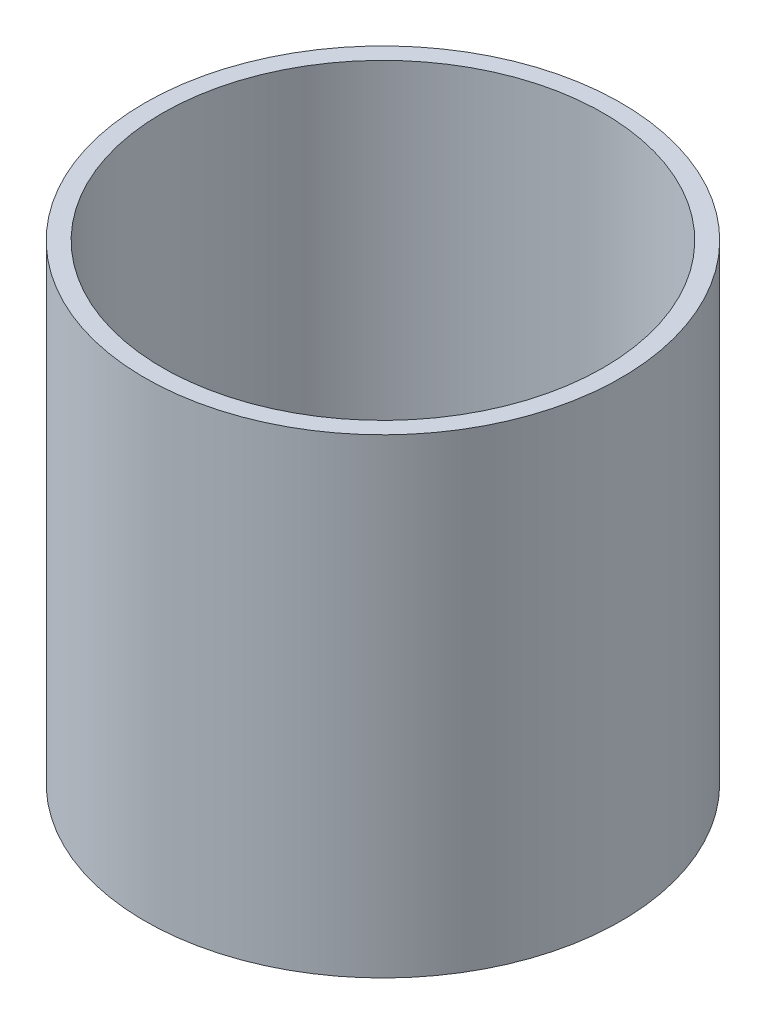
ISO-10303-21;
HEADER;
FILE_DESCRIPTION(('STEP AP214'),'2;1');
FILE_NAME('part.step','',(''),(''),'','','');
FILE_SCHEMA(('AUTOMOTIVE_DESIGN { 1 0 10303 214 1 1 1 1 }'));
ENDSEC;
DATA;
#1=APPLICATION_CONTEXT('core data for automotive mechanical design processes');
#2=APPLICATION_PROTOCOL_DEFINITION('international standard','automotive_design',2000,#1);
#3=PRODUCT_CONTEXT('',#1,'mechanical');
#4=PRODUCT('Part','Part','',(#3));
#5=PRODUCT_RELATED_PRODUCT_CATEGORY('part','',(#4));
#6=PRODUCT_DEFINITION_FORMATION('','',#4);
#7=PRODUCT_DEFINITION_CONTEXT('part definition',#1,'design');
#8=PRODUCT_DEFINITION('design','',#6,#7);
#9=PRODUCT_DEFINITION_SHAPE('','',#8);
#10=(LENGTH_UNIT() NAMED_UNIT(*) SI_UNIT(.MILLI.,.METRE.));
#11=(NAMED_UNIT(*) PLANE_ANGLE_UNIT() SI_UNIT($,.RADIAN.));
#12=(NAMED_UNIT(*) SI_UNIT($,.STERADIAN.) SOLID_ANGLE_UNIT());
#13=UNCERTAINTY_MEASURE_WITH_UNIT(LENGTH_MEASURE(1.E-05),#10,'distance_accuracy_value','');
#14=(GEOMETRIC_REPRESENTATION_CONTEXT(3) GLOBAL_UNCERTAINTY_ASSIGNED_CONTEXT((#13)) GLOBAL_UNIT_ASSIGNED_CONTEXT((#10,
#11,#12)) REPRESENTATION_CONTEXT('',''));
#15=CARTESIAN_POINT('',(0.,0.,0.));
#16=DIRECTION('',(0.,0.,1.));
#17=DIRECTION('',(1.,0.,0.));
#18=AXIS2_PLACEMENT_3D('',#15,#16,#17);
#19=CARTESIAN_POINT('',(-27.5,5.5,0.));
#20=DIRECTION('',(0.,1.,0.));
#21=DIRECTION('',(-1.,0.,0.));
#22=AXIS2_PLACEMENT_3D('',#19,#20,#21);
#23=PLANE('',#22);
#24=CARTESIAN_POINT('',(12.7,5.5,0.));
#25=DIRECTION('',(0.,1.,0.));
#26=DIRECTION('',(-1.,0.,0.));
#27=AXIS2_PLACEMENT_3D('',#24,#25,#26);
#28=CIRCLE('',#27,1.88162581394964);
#29=CARTESIAN_POINT('',(10.8183741860504,5.5,0.));
#30=VERTEX_POINT('',#29);
#31=EDGE_CURVE('E81',#30,#30,#28,.F.);
#32=ORIENTED_EDGE('',*,*,#31,.T.);
#33=EDGE_LOOP('',(#32));
#34=FACE_BOUND('',#33,.T.);
#35=CARTESIAN_POINT('',(0.,5.5,-12.7));
#36=DIRECTION('',(0.,1.,0.));
#37=DIRECTION('',(-1.,0.,0.));
#38=AXIS2_PLACEMENT_3D('',#35,#36,#37);
#39=CIRCLE('',#38,1.88162581394964);
#40=CARTESIAN_POINT('',(-1.88162581394964,5.5,-12.7));
#41=VERTEX_POINT('',#40);
#42=EDGE_CURVE('E75',#41,#41,#39,.F.);
#43=ORIENTED_EDGE('',*,*,#42,.T.);
#44=EDGE_LOOP('',(#43));
#45=FACE_BOUND('',#44,.T.);
#46=CARTESIAN_POINT('',(-12.7,5.5,1.33025439009923E-13));
#47=DIRECTION('',(0.,1.,0.));
#48=DIRECTION('',(-1.,0.,0.));
#49=AXIS2_PLACEMENT_3D('',#46,#47,#48);
#50=CIRCLE('',#49,1.88162581394964);
#51=CARTESIAN_POINT('',(-14.5816258139496,5.5,1.33025439009923E-13));
#52=VERTEX_POINT('',#51);
#53=EDGE_CURVE('E69',#52,#52,#50,.F.);
#54=ORIENTED_EDGE('',*,*,#53,.T.);
#55=EDGE_LOOP('',(#54));
#56=FACE_BOUND('',#55,.T.);
#57=CARTESIAN_POINT('',(0.,5.5,12.7));
#58=DIRECTION('',(0.,1.,0.));
#59=DIRECTION('',(-1.,0.,0.));
#60=AXIS2_PLACEMENT_3D('',#57,#58,#59);
#61=CIRCLE('',#60,1.88162581394964);
#62=CARTESIAN_POINT('',(-1.88162581394964,5.5,12.7));
#63=VERTEX_POINT('',#62);
#64=EDGE_CURVE('E62',#63,#63,#61,.F.);
#65=ORIENTED_EDGE('',*,*,#64,.T.);
#66=EDGE_LOOP('',(#65));
#67=FACE_BOUND('',#66,.T.);
#68=CARTESIAN_POINT('',(0.,5.5,0.));
#69=DIRECTION('',(0.,1.,0.));
#70=DIRECTION('',(-1.,0.,0.));
#71=AXIS2_PLACEMENT_3D('',#68,#69,#70);
#72=CIRCLE('',#71,27.5);
#73=CARTESIAN_POINT('',(-27.5,5.50000000000001,0.));
#74=VERTEX_POINT('',#73);
#75=EDGE_CURVE('E10',#74,#74,#72,.T.);
#76=ORIENTED_EDGE('',*,*,#75,.T.);
#77=EDGE_LOOP('',(#76));
#78=FACE_BOUND('',#77,.T.);
#79=ADVANCED_FACE('F37',(#34,#45,#56,#67,#78),#23,.T.);
#80=CARTESIAN_POINT('',(0.,15.5,0.));
#81=DIRECTION('',(0.,1.,0.));
#82=DIRECTION('',(-1.,0.,0.));
#83=AXIS2_PLACEMENT_3D('',#80,#81,#82);
#84=TOROIDAL_SURFACE('',#83,27.5,10.);
#85=CARTESIAN_POINT('',(0.,15.5,0.));
#86=DIRECTION('',(0.,1.,0.));
#87=DIRECTION('',(-1.,0.,0.));
#88=AXIS2_PLACEMENT_3D('',#85,#86,#87);
#89=CIRCLE('',#88,37.5);
#90=CARTESIAN_POINT('',(-37.5,15.5,0.));
#91=VERTEX_POINT('',#90);
#92=EDGE_CURVE('E44',#91,#91,#89,.T.);
#93=ORIENTED_EDGE('',*,*,#92,.T.);
#94=EDGE_LOOP('',(#93));
#95=FACE_BOUND('',#94,.T.);
#96=ORIENTED_EDGE('',*,*,#75,.F.);
#97=EDGE_LOOP('',(#96));
#98=FACE_BOUND('',#97,.T.);
#99=ADVANCED_FACE('F117',(#95,#98),#84,.F.);
#100=CARTESIAN_POINT('',(0.,5.5,0.));
#101=DIRECTION('',(0.,1.,0.));
#102=DIRECTION('',(-1.,0.,0.));
#103=AXIS2_PLACEMENT_3D('',#100,#101,#102);
#104=CYLINDRICAL_SURFACE('',#103,37.5);
#105=CARTESIAN_POINT('',(0.,80.,0.));
#106=DIRECTION('',(0.,1.,0.));
#107=DIRECTION('',(-1.,0.,0.));
#108=AXIS2_PLACEMENT_3D('',#105,#106,#107);
#109=CIRCLE('',#108,37.5);
#110=CARTESIAN_POINT('',(-37.5,80.,0.));
#111=VERTEX_POINT('',#110);
#112=EDGE_CURVE('E49',#111,#111,#109,.T.);
#113=ORIENTED_EDGE('',*,*,#112,.T.);
#114=EDGE_LOOP('',(#113));
#115=FACE_BOUND('',#114,.T.);
#116=ORIENTED_EDGE('',*,*,#92,.F.);
#117=EDGE_LOOP('',(#116));
#118=FACE_BOUND('',#117,.T.);
#119=ADVANCED_FACE('F111',(#115,#118),#104,.F.);
#120=CARTESIAN_POINT('',(-40.5,80.,0.));
#121=DIRECTION('',(0.,1.,0.));
#122=DIRECTION('',(-1.,0.,0.));
#123=AXIS2_PLACEMENT_3D('',#120,#121,#122);
#124=PLANE('',#123);
#125=CARTESIAN_POINT('',(0.,80.,0.));
#126=DIRECTION('',(0.,1.,0.));
#127=DIRECTION('',(-1.,0.,0.));
#128=AXIS2_PLACEMENT_3D('',#125,#126,#127);
#129=CIRCLE('',#128,40.5);
#130=CARTESIAN_POINT('',(-40.5,80.,0.));
#131=VERTEX_POINT('',#130);
#132=EDGE_CURVE('E53',#131,#131,#129,.T.);
#133=ORIENTED_EDGE('',*,*,#132,.T.);
#134=EDGE_LOOP('',(#133));
#135=FACE_BOUND('',#134,.T.);
#136=ORIENTED_EDGE('',*,*,#112,.F.);
#137=EDGE_LOOP('',(#136));
#138=FACE_BOUND('',#137,.T.);
#139=ADVANCED_FACE('F105',(#135,#138),#124,.T.);
#140=CARTESIAN_POINT('',(0.,5.5,0.));
#141=DIRECTION('',(0.,1.,0.));
#142=DIRECTION('',(-1.,0.,0.));
#143=AXIS2_PLACEMENT_3D('',#140,#141,#142);
#144=CYLINDRICAL_SURFACE('',#143,40.5);
#145=CARTESIAN_POINT('',(0.,0.,0.));
#146=DIRECTION('',(0.,1.,0.));
#147=DIRECTION('',(-1.,0.,0.));
#148=AXIS2_PLACEMENT_3D('',#145,#146,#147);
#149=CIRCLE('',#148,40.5);
#150=CARTESIAN_POINT('',(-40.5,0.,0.));
#151=VERTEX_POINT('',#150);
#152=EDGE_CURVE('E58',#151,#151,#149,.T.);
#153=ORIENTED_EDGE('',*,*,#152,.T.);
#154=EDGE_LOOP('',(#153));
#155=FACE_BOUND('',#154,.T.);
#156=ORIENTED_EDGE('',*,*,#132,.F.);
#157=EDGE_LOOP('',(#156));
#158=FACE_BOUND('',#157,.T.);
#159=ADVANCED_FACE('F93',(#155,#158),#144,.T.);
#160=CARTESIAN_POINT('',(0.,0.,0.));
#161=DIRECTION('',(0.,-1.,0.));
#162=DIRECTION('',(1.,0.,0.));
#163=AXIS2_PLACEMENT_3D('',#160,#161,#162);
#164=PLANE('',#163);
#165=CARTESIAN_POINT('',(12.7,0.,0.));
#166=DIRECTION('',(0.,-1.,0.));
#167=DIRECTION('',(0.,0.,-1.));
#168=AXIS2_PLACEMENT_3D('',#165,#166,#167);
#169=CIRCLE('',#168,2.3);
#170=CARTESIAN_POINT('',(12.7,0.,-2.30000000000004));
#171=VERTEX_POINT('',#170);
#172=EDGE_CURVE('E65',#171,#171,#169,.T.);
#173=ORIENTED_EDGE('',*,*,#172,.F.);
#174=EDGE_LOOP('',(#173));
#175=FACE_BOUND('',#174,.T.);
#176=CARTESIAN_POINT('',(0.,0.,-12.7));
#177=DIRECTION('',(0.,-1.,0.));
#178=DIRECTION('',(-1.,0.,0.));
#179=AXIS2_PLACEMENT_3D('',#176,#177,#178);
#180=CIRCLE('',#179,2.3);
#181=CARTESIAN_POINT('',(-2.3,0.,-12.7));
#182=VERTEX_POINT('',#181);
#183=EDGE_CURVE('E78',#182,#182,#180,.T.);
#184=ORIENTED_EDGE('',*,*,#183,.F.);
#185=EDGE_LOOP('',(#184));
#186=FACE_BOUND('',#185,.T.);
#187=CARTESIAN_POINT('',(-12.7,0.,1.33025439009923E-13));
#188=DIRECTION('',(0.,-1.,0.));
#189=DIRECTION('',(0.,0.,1.));
#190=AXIS2_PLACEMENT_3D('',#187,#188,#189);
#191=CIRCLE('',#190,2.3);
#192=CARTESIAN_POINT('',(-12.7,0.,2.30000000000013));
#193=VERTEX_POINT('',#192);
#194=EDGE_CURVE('E72',#193,#193,#191,.T.);
#195=ORIENTED_EDGE('',*,*,#194,.F.);
#196=EDGE_LOOP('',(#195));
#197=FACE_BOUND('',#196,.T.);
#198=CARTESIAN_POINT('',(0.,0.,12.7));
#199=DIRECTION('',(0.,-1.,0.));
#200=DIRECTION('',(1.,0.,0.));
#201=AXIS2_PLACEMENT_3D('',#198,#199,#200);
#202=CIRCLE('',#201,2.3);
#203=CARTESIAN_POINT('',(2.3,0.,12.7));
#204=VERTEX_POINT('',#203);
#205=EDGE_CURVE('E61',#204,#204,#202,.T.);
#206=ORIENTED_EDGE('',*,*,#205,.F.);
#207=EDGE_LOOP('',(#206));
#208=FACE_BOUND('',#207,.T.);
#209=ORIENTED_EDGE('',*,*,#152,.F.);
#210=EDGE_LOOP('',(#209));
#211=FACE_BOUND('',#210,.T.);
#212=ADVANCED_FACE('F89',(#175,#186,#197,#208,#211),#164,.T.);
#213=CARTESIAN_POINT('',(0.,0.,12.7));
#214=DIRECTION('',(0.,-1.,0.));
#215=DIRECTION('',(1.,0.,0.));
#216=AXIS2_PLACEMENT_3D('',#213,#214,#215);
#217=CONICAL_SURFACE('',#216,2.3,0.0759218224617535);
#218=ORIENTED_EDGE('',*,*,#64,.F.);
#219=EDGE_LOOP('',(#218));
#220=FACE_BOUND('',#219,.T.);
#221=ORIENTED_EDGE('',*,*,#205,.T.);
#222=EDGE_LOOP('',(#221));
#223=FACE_BOUND('',#222,.T.);
#224=ADVANCED_FACE('F92',(#220,#223),#217,.F.);
#225=CARTESIAN_POINT('',(-12.7,0.,1.33025439009923E-13));
#226=DIRECTION('',(0.,-1.,0.));
#227=DIRECTION('',(0.,0.,1.));
#228=AXIS2_PLACEMENT_3D('',#225,#226,#227);
#229=CONICAL_SURFACE('',#228,2.3,0.0759218224617535);
#230=ORIENTED_EDGE('',*,*,#53,.F.);
#231=EDGE_LOOP('',(#230));
#232=FACE_BOUND('',#231,.T.);
#233=ORIENTED_EDGE('',*,*,#194,.T.);
#234=EDGE_LOOP('',(#233));
#235=FACE_BOUND('',#234,.T.);
#236=ADVANCED_FACE('F136',(#232,#235),#229,.F.);
#237=CARTESIAN_POINT('',(0.,0.,-12.7));
#238=DIRECTION('',(0.,-1.,0.));
#239=DIRECTION('',(-1.,0.,0.));
#240=AXIS2_PLACEMENT_3D('',#237,#238,#239);
#241=CONICAL_SURFACE('',#240,2.3,0.0759218224617535);
#242=ORIENTED_EDGE('',*,*,#42,.F.);
#243=EDGE_LOOP('',(#242));
#244=FACE_BOUND('',#243,.T.);
#245=ORIENTED_EDGE('',*,*,#183,.T.);
#246=EDGE_LOOP('',(#245));
#247=FACE_BOUND('',#246,.T.);
#248=ADVANCED_FACE('F141',(#244,#247),#241,.F.);
#249=CARTESIAN_POINT('',(12.7,0.,0.));
#250=DIRECTION('',(0.,-1.,0.));
#251=DIRECTION('',(0.,0.,-1.));
#252=AXIS2_PLACEMENT_3D('',#249,#250,#251);
#253=CONICAL_SURFACE('',#252,2.3,0.0759218224617535);
#254=ORIENTED_EDGE('',*,*,#31,.F.);
#255=EDGE_LOOP('',(#254));
#256=FACE_BOUND('',#255,.T.);
#257=ORIENTED_EDGE('',*,*,#172,.T.);
#258=EDGE_LOOP('',(#257));
#259=FACE_BOUND('',#258,.T.);
#260=ADVANCED_FACE('F87',(#256,#259),#253,.F.);
#261=CLOSED_SHELL('',(#79,#99,#119,#139,#159,#212,#224,#236,#248,#260));
#262=MANIFOLD_SOLID_BREP('B2',#261);
#263=ADVANCED_BREP_SHAPE_REPRESENTATION('',(#18,#262),#14);
#264=SHAPE_DEFINITION_REPRESENTATION(#9,#263);
ENDSEC;
END-ISO-10303-21;
